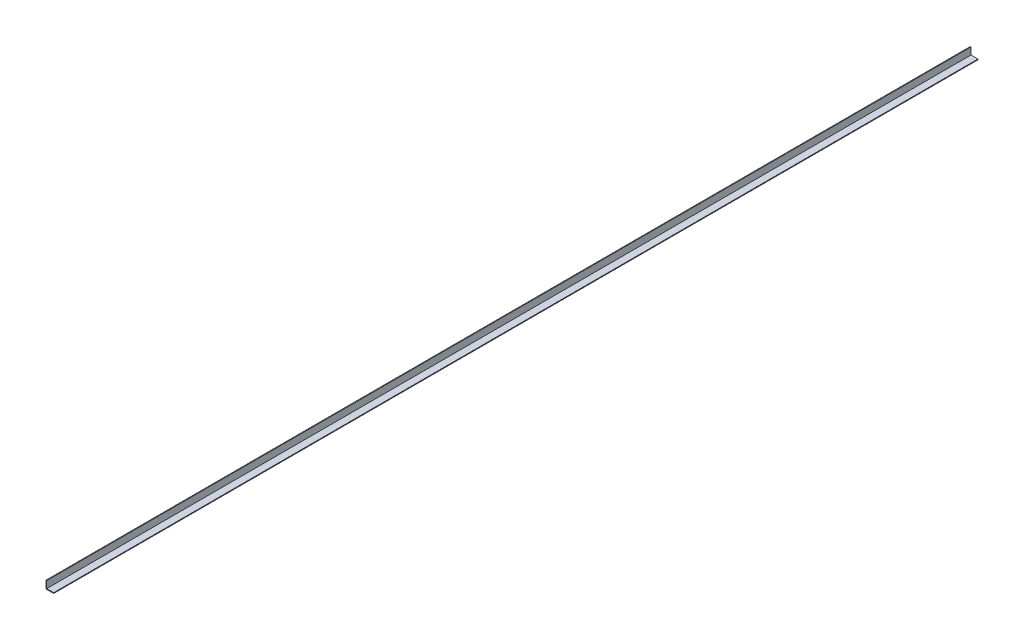
ISO-10303-21;
HEADER;
FILE_DESCRIPTION(('STEP AP214'),'2;1');
FILE_NAME('part.step','',(''),(''),'','','');
FILE_SCHEMA(('AUTOMOTIVE_DESIGN { 1 0 10303 214 1 1 1 1 }'));
ENDSEC;
DATA;
#1=APPLICATION_CONTEXT('core data for automotive mechanical design processes');
#2=APPLICATION_PROTOCOL_DEFINITION('international standard','automotive_design',2000,#1);
#3=PRODUCT_CONTEXT('',#1,'mechanical');
#4=PRODUCT('Part','Part','',(#3));
#5=PRODUCT_RELATED_PRODUCT_CATEGORY('part','',(#4));
#6=PRODUCT_DEFINITION_FORMATION('','',#4);
#7=PRODUCT_DEFINITION_CONTEXT('part definition',#1,'design');
#8=PRODUCT_DEFINITION('design','',#6,#7);
#9=PRODUCT_DEFINITION_SHAPE('','',#8);
#10=(LENGTH_UNIT() NAMED_UNIT(*) SI_UNIT(.MILLI.,.METRE.));
#11=(NAMED_UNIT(*) PLANE_ANGLE_UNIT() SI_UNIT($,.RADIAN.));
#12=(NAMED_UNIT(*) SI_UNIT($,.STERADIAN.) SOLID_ANGLE_UNIT());
#13=UNCERTAINTY_MEASURE_WITH_UNIT(LENGTH_MEASURE(1.E-05),#10,'distance_accuracy_value','');
#14=(GEOMETRIC_REPRESENTATION_CONTEXT(3) GLOBAL_UNCERTAINTY_ASSIGNED_CONTEXT((#13)) GLOBAL_UNIT_ASSIGNED_CONTEXT((#10,
#11,#12)) REPRESENTATION_CONTEXT('',''));
#15=CARTESIAN_POINT('',(0.,0.,0.));
#16=DIRECTION('',(0.,0.,1.));
#17=DIRECTION('',(1.,0.,0.));
#18=AXIS2_PLACEMENT_3D('',#15,#16,#17);
#19=CARTESIAN_POINT('',(4.76,50.8,-6100.));
#20=DIRECTION('',(0.,1.,0.));
#21=DIRECTION('',(0.,0.,1.));
#22=AXIS2_PLACEMENT_3D('',#19,#20,#21);
#23=PLANE('',#22);
#24=DIRECTION('',(-1.,0.,0.));
#25=VECTOR('',#24,1.);
#26=CARTESIAN_POINT('',(4.76,50.8,0.));
#27=LINE('',#26,#25);
#28=CARTESIAN_POINT('',(4.76,50.8,0.));
#29=VERTEX_POINT('',#28);
#30=CARTESIAN_POINT('',(0.,50.8,0.));
#31=VERTEX_POINT('',#30);
#32=EDGE_CURVE('E118',#29,#31,#27,.T.);
#33=ORIENTED_EDGE('',*,*,#32,.F.);
#34=DIRECTION('',(0.,0.,1.));
#35=VECTOR('',#34,1.);
#36=CARTESIAN_POINT('',(4.76,50.8,-6100.));
#37=LINE('',#36,#35);
#38=CARTESIAN_POINT('',(4.76,50.8,-6100.));
#39=VERTEX_POINT('',#38);
#40=EDGE_CURVE('E11',#39,#29,#37,.T.);
#41=ORIENTED_EDGE('',*,*,#40,.F.);
#42=DIRECTION('',(-1.,0.,0.));
#43=VECTOR('',#42,1.);
#44=CARTESIAN_POINT('',(4.76,50.8,-6100.));
#45=LINE('',#44,#43);
#46=CARTESIAN_POINT('',(0.,50.8,-6100.));
#47=VERTEX_POINT('',#46);
#48=EDGE_CURVE('E132',#39,#47,#45,.T.);
#49=ORIENTED_EDGE('',*,*,#48,.T.);
#50=DIRECTION('',(0.,0.,1.));
#51=VECTOR('',#50,1.);
#52=CARTESIAN_POINT('',(0.,50.8,-6100.));
#53=LINE('',#52,#51);
#54=EDGE_CURVE('E36',#47,#31,#53,.T.);
#55=ORIENTED_EDGE('',*,*,#54,.T.);
#56=EDGE_LOOP('',(#33,#41,#49,#55));
#57=FACE_BOUND('',#56,.T.);
#58=ADVANCED_FACE('F33',(#57),#23,.T.);
#59=CARTESIAN_POINT('',(4.76,4.76,-6100.));
#60=DIRECTION('',(1.,0.,0.));
#61=DIRECTION('',(0.,1.,0.));
#62=AXIS2_PLACEMENT_3D('',#59,#60,#61);
#63=PLANE('',#62);
#64=DIRECTION('',(0.,1.,0.));
#65=VECTOR('',#64,1.);
#66=CARTESIAN_POINT('',(4.76,4.76,0.));
#67=LINE('',#66,#65);
#68=CARTESIAN_POINT('',(4.76,4.76,0.));
#69=VERTEX_POINT('',#68);
#70=EDGE_CURVE('E130',#69,#29,#67,.T.);
#71=ORIENTED_EDGE('',*,*,#70,.F.);
#72=DIRECTION('',(0.,0.,1.));
#73=VECTOR('',#72,1.);
#74=CARTESIAN_POINT('',(4.76,4.76,-6100.));
#75=LINE('',#74,#73);
#76=CARTESIAN_POINT('',(4.76,4.76,-6100.));
#77=VERTEX_POINT('',#76);
#78=EDGE_CURVE('E42',#77,#69,#75,.T.);
#79=ORIENTED_EDGE('',*,*,#78,.F.);
#80=DIRECTION('',(0.,1.,0.));
#81=VECTOR('',#80,1.);
#82=CARTESIAN_POINT('',(4.76,4.76,-6100.));
#83=LINE('',#82,#81);
#84=EDGE_CURVE('E108',#77,#39,#83,.T.);
#85=ORIENTED_EDGE('',*,*,#84,.T.);
#86=ORIENTED_EDGE('',*,*,#40,.T.);
#87=EDGE_LOOP('',(#71,#79,#85,#86));
#88=FACE_BOUND('',#87,.T.);
#89=ADVANCED_FACE('F140',(#88),#63,.T.);
#90=CARTESIAN_POINT('',(50.8,4.76,-6100.));
#91=DIRECTION('',(0.,1.,0.));
#92=DIRECTION('',(-1.,0.,0.));
#93=AXIS2_PLACEMENT_3D('',#90,#91,#92);
#94=PLANE('',#93);
#95=DIRECTION('',(-1.,0.,0.));
#96=VECTOR('',#95,1.);
#97=CARTESIAN_POINT('',(50.8,4.76,0.));
#98=LINE('',#97,#96);
#99=CARTESIAN_POINT('',(50.8,4.76,0.));
#100=VERTEX_POINT('',#99);
#101=EDGE_CURVE('E95',#100,#69,#98,.T.);
#102=ORIENTED_EDGE('',*,*,#101,.F.);
#103=DIRECTION('',(0.,0.,1.));
#104=VECTOR('',#103,1.);
#105=CARTESIAN_POINT('',(50.8,4.76,-6100.));
#106=LINE('',#105,#104);
#107=CARTESIAN_POINT('',(50.8,4.76,-6100.));
#108=VERTEX_POINT('',#107);
#109=EDGE_CURVE('E90',#108,#100,#106,.T.);
#110=ORIENTED_EDGE('',*,*,#109,.F.);
#111=DIRECTION('',(-1.,0.,0.));
#112=VECTOR('',#111,1.);
#113=CARTESIAN_POINT('',(50.8,4.76,-6100.));
#114=LINE('',#113,#112);
#115=EDGE_CURVE('E93',#108,#77,#114,.T.);
#116=ORIENTED_EDGE('',*,*,#115,.T.);
#117=ORIENTED_EDGE('',*,*,#78,.T.);
#118=EDGE_LOOP('',(#102,#110,#116,#117));
#119=FACE_BOUND('',#118,.T.);
#120=ADVANCED_FACE('F92',(#119),#94,.T.);
#121=CARTESIAN_POINT('',(50.8,0.,-6100.));
#122=DIRECTION('',(1.,0.,0.));
#123=DIRECTION('',(0.,0.,-1.));
#124=AXIS2_PLACEMENT_3D('',#121,#122,#123);
#125=PLANE('',#124);
#126=DIRECTION('',(0.,1.,0.));
#127=VECTOR('',#126,1.);
#128=CARTESIAN_POINT('',(50.8,0.,0.));
#129=LINE('',#128,#127);
#130=CARTESIAN_POINT('',(50.8,0.,0.));
#131=VERTEX_POINT('',#130);
#132=EDGE_CURVE('E127',#131,#100,#129,.T.);
#133=ORIENTED_EDGE('',*,*,#132,.F.);
#134=DIRECTION('',(0.,0.,1.));
#135=VECTOR('',#134,1.);
#136=CARTESIAN_POINT('',(50.8,0.,-6100.));
#137=LINE('',#136,#135);
#138=CARTESIAN_POINT('',(50.8,0.,-6100.));
#139=VERTEX_POINT('',#138);
#140=EDGE_CURVE('E100',#139,#131,#137,.T.);
#141=ORIENTED_EDGE('',*,*,#140,.F.);
#142=DIRECTION('',(0.,1.,0.));
#143=VECTOR('',#142,1.);
#144=CARTESIAN_POINT('',(50.8,0.,-6100.));
#145=LINE('',#144,#143);
#146=EDGE_CURVE('E106',#139,#108,#145,.T.);
#147=ORIENTED_EDGE('',*,*,#146,.T.);
#148=ORIENTED_EDGE('',*,*,#109,.T.);
#149=EDGE_LOOP('',(#133,#141,#147,#148));
#150=FACE_BOUND('',#149,.T.);
#151=ADVANCED_FACE('F110',(#150),#125,.T.);
#152=CARTESIAN_POINT('',(0.,0.,-6100.));
#153=DIRECTION('',(0.,-1.,0.));
#154=DIRECTION('',(0.,0.,-1.));
#155=AXIS2_PLACEMENT_3D('',#152,#153,#154);
#156=PLANE('',#155);
#157=DIRECTION('',(1.,0.,0.));
#158=VECTOR('',#157,1.);
#159=CARTESIAN_POINT('',(0.,0.,0.));
#160=LINE('',#159,#158);
#161=CARTESIAN_POINT('',(0.,0.,0.));
#162=VERTEX_POINT('',#161);
#163=EDGE_CURVE('E124',#162,#131,#160,.T.);
#164=ORIENTED_EDGE('',*,*,#163,.F.);
#165=DIRECTION('',(0.,0.,1.));
#166=VECTOR('',#165,1.);
#167=CARTESIAN_POINT('',(0.,0.,-6100.));
#168=LINE('',#167,#166);
#169=CARTESIAN_POINT('',(0.,0.,-6100.));
#170=VERTEX_POINT('',#169);
#171=EDGE_CURVE('E135',#170,#162,#168,.T.);
#172=ORIENTED_EDGE('',*,*,#171,.F.);
#173=DIRECTION('',(1.,0.,0.));
#174=VECTOR('',#173,1.);
#175=CARTESIAN_POINT('',(0.,0.,-6100.));
#176=LINE('',#175,#174);
#177=EDGE_CURVE('E111',#170,#139,#176,.T.);
#178=ORIENTED_EDGE('',*,*,#177,.T.);
#179=ORIENTED_EDGE('',*,*,#140,.T.);
#180=EDGE_LOOP('',(#164,#172,#178,#179));
#181=FACE_BOUND('',#180,.T.);
#182=ADVANCED_FACE('F153',(#181),#156,.T.);
#183=CARTESIAN_POINT('',(0.,50.8,-6100.));
#184=DIRECTION('',(-1.,0.,0.));
#185=DIRECTION('',(0.,-1.,0.));
#186=AXIS2_PLACEMENT_3D('',#183,#184,#185);
#187=PLANE('',#186);
#188=DIRECTION('',(0.,-1.,0.));
#189=VECTOR('',#188,1.);
#190=CARTESIAN_POINT('',(0.,50.8,0.));
#191=LINE('',#190,#189);
#192=EDGE_CURVE('E121',#31,#162,#191,.T.);
#193=ORIENTED_EDGE('',*,*,#192,.F.);
#194=ORIENTED_EDGE('',*,*,#54,.F.);
#195=DIRECTION('',(0.,-1.,0.));
#196=VECTOR('',#195,1.);
#197=CARTESIAN_POINT('',(0.,50.8,-6100.));
#198=LINE('',#197,#196);
#199=EDGE_CURVE('E113',#47,#170,#198,.T.);
#200=ORIENTED_EDGE('',*,*,#199,.T.);
#201=ORIENTED_EDGE('',*,*,#171,.T.);
#202=EDGE_LOOP('',(#193,#194,#200,#201));
#203=FACE_BOUND('',#202,.T.);
#204=ADVANCED_FACE('F137',(#203),#187,.T.);
#205=CARTESIAN_POINT('',(0.,0.,-6100.));
#206=DIRECTION('',(0.,0.,1.));
#207=DIRECTION('',(1.,0.,0.));
#208=AXIS2_PLACEMENT_3D('',#205,#206,#207);
#209=PLANE('',#208);
#210=ORIENTED_EDGE('',*,*,#48,.F.);
#211=ORIENTED_EDGE('',*,*,#84,.F.);
#212=ORIENTED_EDGE('',*,*,#115,.F.);
#213=ORIENTED_EDGE('',*,*,#146,.F.);
#214=ORIENTED_EDGE('',*,*,#177,.F.);
#215=ORIENTED_EDGE('',*,*,#199,.F.);
#216=EDGE_LOOP('',(#210,#211,#212,#213,#214,#215));
#217=FACE_BOUND('',#216,.T.);
#218=ADVANCED_FACE('F104',(#217),#209,.F.);
#219=CARTESIAN_POINT('',(0.,0.,0.));
#220=DIRECTION('',(0.,0.,1.));
#221=DIRECTION('',(1.,0.,0.));
#222=AXIS2_PLACEMENT_3D('',#219,#220,#221);
#223=PLANE('',#222);
#224=ORIENTED_EDGE('',*,*,#32,.T.);
#225=ORIENTED_EDGE('',*,*,#192,.T.);
#226=ORIENTED_EDGE('',*,*,#163,.T.);
#227=ORIENTED_EDGE('',*,*,#132,.T.);
#228=ORIENTED_EDGE('',*,*,#101,.T.);
#229=ORIENTED_EDGE('',*,*,#70,.T.);
#230=EDGE_LOOP('',(#224,#225,#226,#227,#228,#229));
#231=FACE_BOUND('',#230,.T.);
#232=ADVANCED_FACE('F139',(#231),#223,.T.);
#233=CLOSED_SHELL('',(#58,#89,#120,#151,#182,#204,#218,#232));
#234=MANIFOLD_SOLID_BREP('B2',#233);
#235=ADVANCED_BREP_SHAPE_REPRESENTATION('',(#18,#234),#14);
#236=SHAPE_DEFINITION_REPRESENTATION(#9,#235);
ENDSEC;
END-ISO-10303-21;
